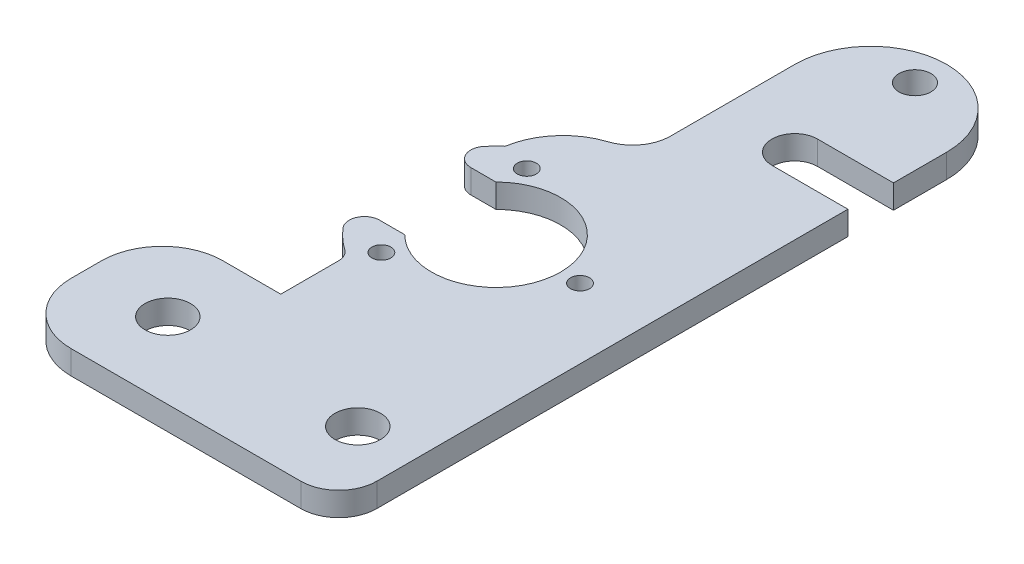
ISO-10303-21;
HEADER;
FILE_DESCRIPTION(('STEP AP214'),'2;1');
FILE_NAME('part.step','',(''),(''),'','','');
FILE_SCHEMA(('AUTOMOTIVE_DESIGN { 1 0 10303 214 1 1 1 1 }'));
ENDSEC;
DATA;
#1=APPLICATION_CONTEXT('core data for automotive mechanical design processes');
#2=APPLICATION_PROTOCOL_DEFINITION('international standard','automotive_design',2000,#1);
#3=PRODUCT_CONTEXT('',#1,'mechanical');
#4=PRODUCT('Part','Part','',(#3));
#5=PRODUCT_RELATED_PRODUCT_CATEGORY('part','',(#4));
#6=PRODUCT_DEFINITION_FORMATION('','',#4);
#7=PRODUCT_DEFINITION_CONTEXT('part definition',#1,'design');
#8=PRODUCT_DEFINITION('design','',#6,#7);
#9=PRODUCT_DEFINITION_SHAPE('','',#8);
#10=(LENGTH_UNIT() NAMED_UNIT(*) SI_UNIT(.MILLI.,.METRE.));
#11=(NAMED_UNIT(*) PLANE_ANGLE_UNIT() SI_UNIT($,.RADIAN.));
#12=(NAMED_UNIT(*) SI_UNIT($,.STERADIAN.) SOLID_ANGLE_UNIT());
#13=UNCERTAINTY_MEASURE_WITH_UNIT(LENGTH_MEASURE(1.E-05),#10,'distance_accuracy_value','');
#14=(GEOMETRIC_REPRESENTATION_CONTEXT(3) GLOBAL_UNCERTAINTY_ASSIGNED_CONTEXT((#13)) GLOBAL_UNIT_ASSIGNED_CONTEXT((#10,
#11,#12)) REPRESENTATION_CONTEXT('',''));
#15=CARTESIAN_POINT('',(0.,0.,0.));
#16=DIRECTION('',(0.,0.,1.));
#17=DIRECTION('',(1.,0.,0.));
#18=AXIS2_PLACEMENT_3D('',#15,#16,#17);
#19=CARTESIAN_POINT('',(43.2374928704917,111.775350881739,110.03328141703));
#20=DIRECTION('',(1.,0.,0.));
#21=DIRECTION('',(0.,1.,0.));
#22=AXIS2_PLACEMENT_3D('',#19,#20,#21);
#23=PLANE('',#22);
#24=DIRECTION('',(0.,1.,0.));
#25=VECTOR('',#24,1.);
#26=CARTESIAN_POINT('',(43.2374928704916,108.650350881738,123.037999922887));
#27=LINE('',#26,#25);
#28=CARTESIAN_POINT('',(43.2374928704916,108.650350881738,123.037999922887));
#29=VERTEX_POINT('',#28);
#30=CARTESIAN_POINT('',(43.2374928704916,111.775350881739,123.037999922887));
#31=VERTEX_POINT('',#30);
#32=EDGE_CURVE('E629',#29,#31,#27,.T.);
#33=ORIENTED_EDGE('',*,*,#32,.T.);
#34=DIRECTION('',(0.,0.,1.));
#35=VECTOR('',#34,1.);
#36=CARTESIAN_POINT('',(43.2374928704917,111.775350881739,110.03328141703));
#37=LINE('',#36,#35);
#38=CARTESIAN_POINT('',(43.2374928704916,111.775350881739,185.037999922887));
#39=VERTEX_POINT('',#38);
#40=EDGE_CURVE('E644',#31,#39,#37,.T.);
#41=ORIENTED_EDGE('',*,*,#40,.T.);
#42=DIRECTION('',(0.,-1.,0.));
#43=VECTOR('',#42,1.);
#44=CARTESIAN_POINT('',(43.2374928704916,111.775350881739,185.037999922887));
#45=LINE('',#44,#43);
#46=CARTESIAN_POINT('',(43.2374928704916,108.650350881739,185.037999922887));
#47=VERTEX_POINT('',#46);
#48=EDGE_CURVE('E305',#39,#47,#45,.T.);
#49=ORIENTED_EDGE('',*,*,#48,.T.);
#50=DIRECTION('',(0.,0.,1.));
#51=VECTOR('',#50,1.);
#52=CARTESIAN_POINT('',(43.2374928704916,108.650350881739,110.03328141703));
#53=LINE('',#52,#51);
#54=EDGE_CURVE('E219',#29,#47,#53,.T.);
#55=ORIENTED_EDGE('',*,*,#54,.F.);
#56=EDGE_LOOP('',(#33,#41,#49,#55));
#57=FACE_BOUND('',#56,.T.);
#58=ADVANCED_FACE('F32',(#57),#23,.T.);
#59=CARTESIAN_POINT('',(33.2374928704917,111.775350881739,110.03328141703));
#60=DIRECTION('',(0.,-1.,0.));
#61=DIRECTION('',(1.,0.,0.));
#62=AXIS2_PLACEMENT_3D('',#59,#60,#61);
#63=CYLINDRICAL_SURFACE('',#62,9.99999999999998);
#64=CARTESIAN_POINT('',(33.2374928704917,108.650350881739,110.03328141703));
#65=DIRECTION('',(0.,-1.,0.));
#66=DIRECTION('',(1.,0.,0.));
#67=AXIS2_PLACEMENT_3D('',#64,#65,#66);
#68=CIRCLE('',#67,9.99999999999998);
#69=CARTESIAN_POINT('',(23.2374928704917,108.650350881739,110.03328141703));
#70=VERTEX_POINT('',#69);
#71=CARTESIAN_POINT('',(43.2374928704916,108.650350881739,110.03328141703));
#72=VERTEX_POINT('',#71);
#73=EDGE_CURVE('E216',#70,#72,#68,.T.);
#74=ORIENTED_EDGE('',*,*,#73,.F.);
#75=DIRECTION('',(0.,-1.,0.));
#76=VECTOR('',#75,1.);
#77=CARTESIAN_POINT('',(23.2374928704917,111.775350881739,110.03328141703));
#78=LINE('',#77,#76);
#79=CARTESIAN_POINT('',(23.2374928704917,111.775350881739,110.03328141703));
#80=VERTEX_POINT('',#79);
#81=EDGE_CURVE('E11',#80,#70,#78,.T.);
#82=ORIENTED_EDGE('',*,*,#81,.F.);
#83=CARTESIAN_POINT('',(33.2374928704917,111.775350881739,110.03328141703));
#84=DIRECTION('',(0.,-1.,0.));
#85=DIRECTION('',(1.,0.,0.));
#86=AXIS2_PLACEMENT_3D('',#83,#84,#85);
#87=CIRCLE('',#86,9.99999999999998);
#88=CARTESIAN_POINT('',(43.2374928704917,111.775350881739,110.03328141703));
#89=VERTEX_POINT('',#88);
#90=EDGE_CURVE('E274',#80,#89,#87,.T.);
#91=ORIENTED_EDGE('',*,*,#90,.T.);
#92=DIRECTION('',(0.,-1.,0.));
#93=VECTOR('',#92,1.);
#94=CARTESIAN_POINT('',(43.2374928704917,111.775350881739,110.03328141703));
#95=LINE('',#94,#93);
#96=EDGE_CURVE('E36',#89,#72,#95,.T.);
#97=ORIENTED_EDGE('',*,*,#96,.T.);
#98=EDGE_LOOP('',(#74,#82,#91,#97));
#99=FACE_BOUND('',#98,.T.);
#100=ADVANCED_FACE('F34',(#99),#63,.T.);
#101=CARTESIAN_POINT('',(23.2374928704917,111.775350881739,126.368020112513));
#102=DIRECTION('',(-1.,0.,0.));
#103=DIRECTION('',(0.,-1.,0.));
#104=AXIS2_PLACEMENT_3D('',#101,#102,#103);
#105=PLANE('',#104);
#106=DIRECTION('',(0.,0.,-1.));
#107=VECTOR('',#106,1.);
#108=CARTESIAN_POINT('',(23.2374928704917,108.650350881739,126.368020112513));
#109=LINE('',#108,#107);
#110=CARTESIAN_POINT('',(23.2374928704916,108.650350881739,126.368020112513));
#111=VERTEX_POINT('',#110);
#112=EDGE_CURVE('E272',#111,#70,#109,.T.);
#113=ORIENTED_EDGE('',*,*,#112,.F.);
#114=DIRECTION('',(0.,-1.,0.));
#115=VECTOR('',#114,1.);
#116=CARTESIAN_POINT('',(23.2374928704916,111.775350881739,126.368020112513));
#117=LINE('',#116,#115);
#118=CARTESIAN_POINT('',(23.2374928704916,111.775350881739,126.368020112513));
#119=VERTEX_POINT('',#118);
#120=EDGE_CURVE('E41',#119,#111,#117,.T.);
#121=ORIENTED_EDGE('',*,*,#120,.F.);
#122=DIRECTION('',(0.,0.,-1.));
#123=VECTOR('',#122,1.);
#124=CARTESIAN_POINT('',(23.2374928704917,111.775350881739,126.368020112513));
#125=LINE('',#124,#123);
#126=EDGE_CURVE('E206',#119,#80,#125,.T.);
#127=ORIENTED_EDGE('',*,*,#126,.T.);
#128=ORIENTED_EDGE('',*,*,#81,.T.);
#129=EDGE_LOOP('',(#113,#121,#127,#128));
#130=FACE_BOUND('',#129,.T.);
#131=ADVANCED_FACE('F320',(#130),#105,.T.);
#132=CARTESIAN_POINT('',(18.2374928704917,111.775350881739,126.368020112513));
#133=DIRECTION('',(0.,-1.,0.));
#134=DIRECTION('',(1.,0.,0.));
#135=AXIS2_PLACEMENT_3D('',#132,#133,#134);
#136=CYLINDRICAL_SURFACE('',#135,4.99999999999989);
#137=CARTESIAN_POINT('',(18.2374928704917,108.650350881739,126.368020112513));
#138=DIRECTION('',(0.,1.,0.));
#139=DIRECTION('',(-1.,0.,0.));
#140=AXIS2_PLACEMENT_3D('',#137,#138,#139);
#141=CIRCLE('',#140,4.99999999999989);
#142=CARTESIAN_POINT('',(19.7743921471171,108.650350881739,131.125954602763));
#143=VERTEX_POINT('',#142);
#144=EDGE_CURVE('E192',#143,#111,#141,.T.);
#145=ORIENTED_EDGE('',*,*,#144,.F.);
#146=DIRECTION('',(0.,-1.,0.));
#147=VECTOR('',#146,1.);
#148=CARTESIAN_POINT('',(19.7743921471171,111.775350881739,131.125954602763));
#149=LINE('',#148,#147);
#150=CARTESIAN_POINT('',(19.7743921471171,111.775350881739,131.125954602763));
#151=VERTEX_POINT('',#150);
#152=EDGE_CURVE('E186',#151,#143,#149,.T.);
#153=ORIENTED_EDGE('',*,*,#152,.F.);
#154=CARTESIAN_POINT('',(18.2374928704917,111.775350881739,126.368020112513));
#155=DIRECTION('',(0.,1.,0.));
#156=DIRECTION('',(-1.,0.,0.));
#157=AXIS2_PLACEMENT_3D('',#154,#155,#156);
#158=CIRCLE('',#157,4.99999999999989);
#159=EDGE_CURVE('E189',#151,#119,#158,.T.);
#160=ORIENTED_EDGE('',*,*,#159,.T.);
#161=ORIENTED_EDGE('',*,*,#120,.T.);
#162=EDGE_LOOP('',(#145,#153,#160,#161));
#163=FACE_BOUND('',#162,.T.);
#164=ADVANCED_FACE('F188',(#163),#136,.F.);
#165=CARTESIAN_POINT('',(22.6068287457931,111.775350881739,139.894614975793));
#166=DIRECTION('',(0.,-1.,0.));
#167=DIRECTION('',(1.,0.,0.));
#168=AXIS2_PLACEMENT_3D('',#165,#166,#167);
#169=CYLINDRICAL_SURFACE('',#168,9.21477627634406);
#170=CARTESIAN_POINT('',(22.6068287457931,108.650350881739,139.894614975793));
#171=DIRECTION('',(0.,-1.,0.));
#172=DIRECTION('',(1.,0.,0.));
#173=AXIS2_PLACEMENT_3D('',#170,#171,#172);
#174=CIRCLE('',#173,9.21477627634406);
#175=CARTESIAN_POINT('',(13.5108446117126,108.650350881739,138.419767710606));
#176=VERTEX_POINT('',#175);
#177=EDGE_CURVE('E269',#176,#143,#174,.T.);
#178=ORIENTED_EDGE('',*,*,#177,.F.);
#179=DIRECTION('',(0.,-1.,0.));
#180=VECTOR('',#179,1.);
#181=CARTESIAN_POINT('',(13.5108446117126,111.775350881739,138.419767710606));
#182=LINE('',#181,#180);
#183=CARTESIAN_POINT('',(13.5108446117126,111.775350881739,138.419767710606));
#184=VERTEX_POINT('',#183);
#185=EDGE_CURVE('E197',#184,#176,#182,.T.);
#186=ORIENTED_EDGE('',*,*,#185,.F.);
#187=CARTESIAN_POINT('',(22.6068287457931,111.775350881739,139.894614975793));
#188=DIRECTION('',(0.,-1.,0.));
#189=DIRECTION('',(1.,0.,0.));
#190=AXIS2_PLACEMENT_3D('',#187,#188,#189);
#191=CIRCLE('',#190,9.21477627634406);
#192=EDGE_CURVE('E204',#184,#151,#191,.T.);
#193=ORIENTED_EDGE('',*,*,#192,.T.);
#194=ORIENTED_EDGE('',*,*,#152,.T.);
#195=EDGE_LOOP('',(#178,#186,#193,#194));
#196=FACE_BOUND('',#195,.T.);
#197=ADVANCED_FACE('F208',(#196),#169,.T.);
#198=CARTESIAN_POINT('',(22.9999928705025,111.775350881739,149.100999922889));
#199=DIRECTION('',(0.,-1.,0.));
#200=DIRECTION('',(1.,0.,0.));
#201=AXIS2_PLACEMENT_3D('',#198,#199,#200);
#202=CYLINDRICAL_SURFACE('',#201,14.2875);
#203=CARTESIAN_POINT('',(22.9999928705025,108.650350881739,149.100999922889));
#204=DIRECTION('',(0.,-1.,0.));
#205=DIRECTION('',(1.,0.,0.));
#206=AXIS2_PLACEMENT_3D('',#203,#204,#205);
#207=CIRCLE('',#206,14.2875);
#208=CARTESIAN_POINT('',(12.1555050456864,108.650350881739,139.798863605493));
#209=VERTEX_POINT('',#208);
#210=EDGE_CURVE('E266',#209,#176,#207,.T.);
#211=ORIENTED_EDGE('',*,*,#210,.F.);
#212=DIRECTION('',(0.,-1.,0.));
#213=VECTOR('',#212,1.);
#214=CARTESIAN_POINT('',(12.1555050456864,111.775350881739,139.798863605493));
#215=LINE('',#214,#213);
#216=CARTESIAN_POINT('',(12.1555050456864,111.775350881739,139.798863605493));
#217=VERTEX_POINT('',#216);
#218=EDGE_CURVE('E278',#217,#209,#215,.T.);
#219=ORIENTED_EDGE('',*,*,#218,.F.);
#220=CARTESIAN_POINT('',(22.9999928705025,111.775350881739,149.100999922889));
#221=DIRECTION('',(0.,-1.,0.));
#222=DIRECTION('',(1.,0.,0.));
#223=AXIS2_PLACEMENT_3D('',#220,#221,#222);
#224=CIRCLE('',#223,14.2875);
#225=EDGE_CURVE('E209',#217,#184,#224,.T.);
#226=ORIENTED_EDGE('',*,*,#225,.T.);
#227=ORIENTED_EDGE('',*,*,#185,.T.);
#228=EDGE_LOOP('',(#211,#219,#226,#227));
#229=FACE_BOUND('',#228,.T.);
#230=ADVANCED_FACE('F397',(#229),#202,.T.);
#231=CARTESIAN_POINT('',(13.673543586343,111.775350881739,141.100999922889));
#232=DIRECTION('',(0.,-1.,0.));
#233=DIRECTION('',(1.,0.,0.));
#234=AXIS2_PLACEMENT_3D('',#231,#232,#233);
#235=CYLINDRICAL_SURFACE('',#234,2.);
#236=CARTESIAN_POINT('',(13.673543586343,108.650350881739,141.100999922889));
#237=DIRECTION('',(0.,-1.,0.));
#238=DIRECTION('',(1.,0.,0.));
#239=AXIS2_PLACEMENT_3D('',#236,#237,#238);
#240=CIRCLE('',#239,2.);
#241=CARTESIAN_POINT('',(13.673543586343,108.650350881739,143.100999922889));
#242=VERTEX_POINT('',#241);
#243=EDGE_CURVE('E263',#242,#209,#240,.T.);
#244=ORIENTED_EDGE('',*,*,#243,.F.);
#245=DIRECTION('',(0.,-1.,0.));
#246=VECTOR('',#245,1.);
#247=CARTESIAN_POINT('',(13.673543586343,111.775350881739,143.100999922889));
#248=LINE('',#247,#246);
#249=CARTESIAN_POINT('',(13.673543586343,111.775350881739,143.100999922889));
#250=VERTEX_POINT('',#249);
#251=EDGE_CURVE('E280',#250,#242,#248,.T.);
#252=ORIENTED_EDGE('',*,*,#251,.F.);
#253=CARTESIAN_POINT('',(13.673543586343,111.775350881739,141.100999922889));
#254=DIRECTION('',(0.,-1.,0.));
#255=DIRECTION('',(1.,0.,0.));
#256=AXIS2_PLACEMENT_3D('',#253,#254,#255);
#257=CIRCLE('',#256,2.);
#258=EDGE_CURVE('E211',#250,#217,#257,.T.);
#259=ORIENTED_EDGE('',*,*,#258,.T.);
#260=ORIENTED_EDGE('',*,*,#218,.T.);
#261=EDGE_LOOP('',(#244,#252,#259,#260));
#262=FACE_BOUND('',#261,.T.);
#263=ADVANCED_FACE('F393',(#262),#235,.T.);
#264=CARTESIAN_POINT('',(16.9791955811063,111.775350881739,143.100999922889));
#265=DIRECTION('',(0.,0.,1.));
#266=DIRECTION('',(1.,0.,0.));
#267=AXIS2_PLACEMENT_3D('',#264,#265,#266);
#268=PLANE('',#267);
#269=DIRECTION('',(-1.,0.,0.));
#270=VECTOR('',#269,1.);
#271=CARTESIAN_POINT('',(16.9791955811063,108.650350881739,143.100999922889));
#272=LINE('',#271,#270);
#273=CARTESIAN_POINT('',(16.9791955811063,108.650350881739,143.100999922889));
#274=VERTEX_POINT('',#273);
#275=EDGE_CURVE('E260',#274,#242,#272,.T.);
#276=ORIENTED_EDGE('',*,*,#275,.F.);
#277=DIRECTION('',(0.,-1.,0.));
#278=VECTOR('',#277,1.);
#279=CARTESIAN_POINT('',(16.9791955811063,111.775350881739,143.100999922889));
#280=LINE('',#279,#278);
#281=CARTESIAN_POINT('',(16.9791955811063,111.775350881739,143.100999922889));
#282=VERTEX_POINT('',#281);
#283=EDGE_CURVE('E282',#282,#274,#280,.T.);
#284=ORIENTED_EDGE('',*,*,#283,.F.);
#285=DIRECTION('',(-1.,0.,0.));
#286=VECTOR('',#285,1.);
#287=CARTESIAN_POINT('',(16.9791955811063,111.775350881739,143.100999922889));
#288=LINE('',#287,#286);
#289=EDGE_CURVE('E683',#282,#250,#288,.T.);
#290=ORIENTED_EDGE('',*,*,#289,.T.);
#291=ORIENTED_EDGE('',*,*,#251,.T.);
#292=EDGE_LOOP('',(#276,#284,#290,#291));
#293=FACE_BOUND('',#292,.T.);
#294=ADVANCED_FACE('F389',(#293),#268,.T.);
#295=CARTESIAN_POINT('',(22.9999928705025,111.775350881739,149.100999922889));
#296=DIRECTION('',(0.,-1.,0.));
#297=DIRECTION('',(1.,0.,0.));
#298=AXIS2_PLACEMENT_3D('',#295,#296,#297);
#299=CYLINDRICAL_SURFACE('',#298,8.50000000000004);
#300=CARTESIAN_POINT('',(22.9999928705025,108.650350881739,149.100999922889));
#301=DIRECTION('',(0.,1.,0.));
#302=DIRECTION('',(-1.,0.,0.));
#303=AXIS2_PLACEMENT_3D('',#300,#301,#302);
#304=CIRCLE('',#303,8.50000000000004);
#305=CARTESIAN_POINT('',(16.9791955811063,108.650350881739,155.100999922889));
#306=VERTEX_POINT('',#305);
#307=EDGE_CURVE('E257',#306,#274,#304,.T.);
#308=ORIENTED_EDGE('',*,*,#307,.F.);
#309=DIRECTION('',(0.,-1.,0.));
#310=VECTOR('',#309,1.);
#311=CARTESIAN_POINT('',(16.9791955811063,111.775350881739,155.100999922889));
#312=LINE('',#311,#310);
#313=CARTESIAN_POINT('',(16.9791955811063,111.775350881739,155.100999922889));
#314=VERTEX_POINT('',#313);
#315=EDGE_CURVE('E284',#314,#306,#312,.T.);
#316=ORIENTED_EDGE('',*,*,#315,.F.);
#317=CARTESIAN_POINT('',(22.9999928705025,111.775350881739,149.100999922889));
#318=DIRECTION('',(0.,1.,0.));
#319=DIRECTION('',(-1.,0.,0.));
#320=AXIS2_PLACEMENT_3D('',#317,#318,#319);
#321=CIRCLE('',#320,8.50000000000004);
#322=EDGE_CURVE('E680',#314,#282,#321,.T.);
#323=ORIENTED_EDGE('',*,*,#322,.T.);
#324=ORIENTED_EDGE('',*,*,#283,.T.);
#325=EDGE_LOOP('',(#308,#316,#323,#324));
#326=FACE_BOUND('',#325,.T.);
#327=ADVANCED_FACE('F385',(#326),#299,.F.);
#328=CARTESIAN_POINT('',(13.6735435863429,111.775350881739,155.100999922889));
#329=DIRECTION('',(0.,0.,-1.));
#330=DIRECTION('',(0.,1.,0.));
#331=AXIS2_PLACEMENT_3D('',#328,#329,#330);
#332=PLANE('',#331);
#333=DIRECTION('',(1.,0.,0.));
#334=VECTOR('',#333,1.);
#335=CARTESIAN_POINT('',(13.6735435863429,108.650350881739,155.100999922889));
#336=LINE('',#335,#334);
#337=CARTESIAN_POINT('',(13.6735435863429,108.650350881739,155.100999922889));
#338=VERTEX_POINT('',#337);
#339=EDGE_CURVE('E254',#338,#306,#336,.T.);
#340=ORIENTED_EDGE('',*,*,#339,.F.);
#341=DIRECTION('',(0.,-1.,0.));
#342=VECTOR('',#341,1.);
#343=CARTESIAN_POINT('',(13.6735435863429,111.775350881739,155.100999922889));
#344=LINE('',#343,#342);
#345=CARTESIAN_POINT('',(13.6735435863429,111.775350881739,155.100999922889));
#346=VERTEX_POINT('',#345);
#347=EDGE_CURVE('E286',#346,#338,#344,.T.);
#348=ORIENTED_EDGE('',*,*,#347,.F.);
#349=DIRECTION('',(1.,0.,0.));
#350=VECTOR('',#349,1.);
#351=CARTESIAN_POINT('',(13.6735435863429,111.775350881739,155.100999922889));
#352=LINE('',#351,#350);
#353=EDGE_CURVE('E677',#346,#314,#352,.T.);
#354=ORIENTED_EDGE('',*,*,#353,.T.);
#355=ORIENTED_EDGE('',*,*,#315,.T.);
#356=EDGE_LOOP('',(#340,#348,#354,#355));
#357=FACE_BOUND('',#356,.T.);
#358=ADVANCED_FACE('F381',(#357),#332,.T.);
#359=CARTESIAN_POINT('',(13.6735435863429,111.775350881739,157.100999922889));
#360=DIRECTION('',(0.,-1.,0.));
#361=DIRECTION('',(1.,0.,0.));
#362=AXIS2_PLACEMENT_3D('',#359,#360,#361);
#363=CYLINDRICAL_SURFACE('',#362,1.99999999999997);
#364=CARTESIAN_POINT('',(13.6735435863429,108.650350881739,157.100999922889));
#365=DIRECTION('',(0.,-1.,0.));
#366=DIRECTION('',(1.,0.,0.));
#367=AXIS2_PLACEMENT_3D('',#364,#365,#366);
#368=CIRCLE('',#367,1.99999999999997);
#369=CARTESIAN_POINT('',(12.1555050456862,108.650350881739,158.403136240285));
#370=VERTEX_POINT('',#369);
#371=EDGE_CURVE('E251',#370,#338,#368,.T.);
#372=ORIENTED_EDGE('',*,*,#371,.F.);
#373=DIRECTION('',(0.,-1.,0.));
#374=VECTOR('',#373,1.);
#375=CARTESIAN_POINT('',(12.1555050456862,111.775350881739,158.403136240285));
#376=LINE('',#375,#374);
#377=CARTESIAN_POINT('',(12.1555050456862,111.775350881739,158.403136240285));
#378=VERTEX_POINT('',#377);
#379=EDGE_CURVE('E288',#378,#370,#376,.T.);
#380=ORIENTED_EDGE('',*,*,#379,.F.);
#381=CARTESIAN_POINT('',(13.6735435863429,111.775350881739,157.100999922889));
#382=DIRECTION('',(0.,-1.,0.));
#383=DIRECTION('',(1.,0.,0.));
#384=AXIS2_PLACEMENT_3D('',#381,#382,#383);
#385=CIRCLE('',#384,1.99999999999997);
#386=EDGE_CURVE('E674',#378,#346,#385,.T.);
#387=ORIENTED_EDGE('',*,*,#386,.T.);
#388=ORIENTED_EDGE('',*,*,#347,.T.);
#389=EDGE_LOOP('',(#372,#380,#387,#388));
#390=FACE_BOUND('',#389,.T.);
#391=ADVANCED_FACE('F377',(#390),#363,.T.);
#392=CARTESIAN_POINT('',(22.9999928705025,111.775350881739,149.100999922889));
#393=DIRECTION('',(0.,-1.,0.));
#394=DIRECTION('',(1.,0.,0.));
#395=AXIS2_PLACEMENT_3D('',#392,#393,#394);
#396=CYLINDRICAL_SURFACE('',#395,14.2875000000001);
#397=CARTESIAN_POINT('',(22.9999928705025,108.650350881739,149.100999922889));
#398=DIRECTION('',(0.,-1.,0.));
#399=DIRECTION('',(1.,0.,0.));
#400=AXIS2_PLACEMENT_3D('',#397,#398,#399);
#401=CIRCLE('',#400,14.2875000000001);
#402=CARTESIAN_POINT('',(14.7577675849363,108.650350881739,160.771406025162));
#403=VERTEX_POINT('',#402);
#404=EDGE_CURVE('E248',#403,#370,#401,.T.);
#405=ORIENTED_EDGE('',*,*,#404,.F.);
#406=DIRECTION('',(0.,-1.,0.));
#407=VECTOR('',#406,1.);
#408=CARTESIAN_POINT('',(14.7577675849363,111.775350881739,160.771406025162));
#409=LINE('',#408,#407);
#410=CARTESIAN_POINT('',(14.7577675849363,111.775350881739,160.771406025162));
#411=VERTEX_POINT('',#410);
#412=EDGE_CURVE('E290',#411,#403,#409,.T.);
#413=ORIENTED_EDGE('',*,*,#412,.F.);
#414=CARTESIAN_POINT('',(22.9999928705025,111.775350881739,149.100999922889));
#415=DIRECTION('',(0.,-1.,0.));
#416=DIRECTION('',(1.,0.,0.));
#417=AXIS2_PLACEMENT_3D('',#414,#415,#416);
#418=CIRCLE('',#417,14.2875000000001);
#419=EDGE_CURVE('E671',#411,#378,#418,.T.);
#420=ORIENTED_EDGE('',*,*,#419,.T.);
#421=ORIENTED_EDGE('',*,*,#379,.T.);
#422=EDGE_LOOP('',(#405,#413,#420,#421));
#423=FACE_BOUND('',#422,.T.);
#424=ADVANCED_FACE('F373',(#423),#396,.T.);
#425=CARTESIAN_POINT('',(13.6040002658721,111.775350881739,162.4050586729));
#426=DIRECTION('',(0.,-1.,0.));
#427=DIRECTION('',(1.,0.,0.));
#428=AXIS2_PLACEMENT_3D('',#425,#426,#427);
#429=CYLINDRICAL_SURFACE('',#428,2.0000000000001);
#430=CARTESIAN_POINT('',(13.6040002658721,108.650350881739,162.4050586729));
#431=DIRECTION('',(0.,1.,0.));
#432=DIRECTION('',(-1.,0.,0.));
#433=AXIS2_PLACEMENT_3D('',#430,#431,#432);
#434=CIRCLE('',#433,2.0000000000001);
#435=CARTESIAN_POINT('',(15.6040002658721,108.650350881739,162.4050586729));
#436=VERTEX_POINT('',#435);
#437=EDGE_CURVE('E245',#436,#403,#434,.T.);
#438=ORIENTED_EDGE('',*,*,#437,.F.);
#439=DIRECTION('',(0.,-1.,0.));
#440=VECTOR('',#439,1.);
#441=CARTESIAN_POINT('',(15.6040002658721,111.775350881739,162.4050586729));
#442=LINE('',#441,#440);
#443=CARTESIAN_POINT('',(15.6040002658721,111.775350881739,162.4050586729));
#444=VERTEX_POINT('',#443);
#445=EDGE_CURVE('E292',#444,#436,#442,.T.);
#446=ORIENTED_EDGE('',*,*,#445,.F.);
#447=CARTESIAN_POINT('',(13.6040002658721,111.775350881739,162.4050586729));
#448=DIRECTION('',(0.,1.,0.));
#449=DIRECTION('',(-1.,0.,0.));
#450=AXIS2_PLACEMENT_3D('',#447,#448,#449);
#451=CIRCLE('',#450,2.0000000000001);
#452=EDGE_CURVE('E668',#444,#411,#451,.T.);
#453=ORIENTED_EDGE('',*,*,#452,.T.);
#454=ORIENTED_EDGE('',*,*,#412,.T.);
#455=EDGE_LOOP('',(#438,#446,#453,#454));
#456=FACE_BOUND('',#455,.T.);
#457=ADVANCED_FACE('F369',(#456),#429,.F.);
#458=CARTESIAN_POINT('',(15.6040002658721,111.775350881739,170.037999922887));
#459=DIRECTION('',(-1.,0.,0.));
#460=DIRECTION('',(0.,-1.,0.));
#461=AXIS2_PLACEMENT_3D('',#458,#459,#460);
#462=PLANE('',#461);
#463=DIRECTION('',(0.,0.,-1.));
#464=VECTOR('',#463,1.);
#465=CARTESIAN_POINT('',(15.6040002658721,108.650350881739,170.037999922887));
#466=LINE('',#465,#464);
#467=CARTESIAN_POINT('',(15.6040002658721,108.650350881739,170.037999922887));
#468=VERTEX_POINT('',#467);
#469=EDGE_CURVE('E242',#468,#436,#466,.T.);
#470=ORIENTED_EDGE('',*,*,#469,.F.);
#471=DIRECTION('',(0.,-1.,0.));
#472=VECTOR('',#471,1.);
#473=CARTESIAN_POINT('',(15.6040002658721,111.775350881739,170.037999922887));
#474=LINE('',#473,#472);
#475=CARTESIAN_POINT('',(15.6040002658721,111.775350881739,170.037999922887));
#476=VERTEX_POINT('',#475);
#477=EDGE_CURVE('E294',#476,#468,#474,.T.);
#478=ORIENTED_EDGE('',*,*,#477,.F.);
#479=DIRECTION('',(0.,0.,-1.));
#480=VECTOR('',#479,1.);
#481=CARTESIAN_POINT('',(15.6040002658721,111.775350881739,170.037999922887));
#482=LINE('',#481,#480);
#483=EDGE_CURVE('E665',#476,#444,#482,.T.);
#484=ORIENTED_EDGE('',*,*,#483,.T.);
#485=ORIENTED_EDGE('',*,*,#445,.T.);
#486=EDGE_LOOP('',(#470,#478,#484,#485));
#487=FACE_BOUND('',#486,.T.);
#488=ADVANCED_FACE('F365',(#487),#462,.T.);
#489=CARTESIAN_POINT('',(7.9999928705023,111.775350881739,170.037999922887));
#490=DIRECTION('',(0.,0.,-1.));
#491=DIRECTION('',(0.,1.,0.));
#492=AXIS2_PLACEMENT_3D('',#489,#490,#491);
#493=PLANE('',#492);
#494=DIRECTION('',(1.,0.,0.));
#495=VECTOR('',#494,1.);
#496=CARTESIAN_POINT('',(7.99999287050228,108.650350881739,170.037999922887));
#497=LINE('',#496,#495);
#498=CARTESIAN_POINT('',(7.99999287050228,108.650350881739,170.037999922887));
#499=VERTEX_POINT('',#498);
#500=EDGE_CURVE('E239',#499,#468,#497,.T.);
#501=ORIENTED_EDGE('',*,*,#500,.F.);
#502=DIRECTION('',(0.,-1.,0.));
#503=VECTOR('',#502,1.);
#504=CARTESIAN_POINT('',(7.9999928705023,111.775350881739,170.037999922887));
#505=LINE('',#504,#503);
#506=CARTESIAN_POINT('',(7.9999928705023,111.775350881739,170.037999922887));
#507=VERTEX_POINT('',#506);
#508=EDGE_CURVE('E296',#507,#499,#505,.T.);
#509=ORIENTED_EDGE('',*,*,#508,.F.);
#510=DIRECTION('',(1.,0.,0.));
#511=VECTOR('',#510,1.);
#512=CARTESIAN_POINT('',(7.9999928705023,111.775350881739,170.037999922887));
#513=LINE('',#512,#511);
#514=EDGE_CURVE('E662',#507,#476,#513,.T.);
#515=ORIENTED_EDGE('',*,*,#514,.T.);
#516=ORIENTED_EDGE('',*,*,#477,.T.);
#517=EDGE_LOOP('',(#501,#509,#515,#516));
#518=FACE_BOUND('',#517,.T.);
#519=ADVANCED_FACE('F361',(#518),#493,.T.);
#520=CARTESIAN_POINT('',(7.9999928705023,111.775350881739,178.037999922887));
#521=DIRECTION('',(0.,-1.,0.));
#522=DIRECTION('',(1.,0.,0.));
#523=AXIS2_PLACEMENT_3D('',#520,#521,#522);
#524=CYLINDRICAL_SURFACE('',#523,7.99999999999999);
#525=CARTESIAN_POINT('',(7.99999287050228,108.650350881739,178.037999922887));
#526=DIRECTION('',(0.,-1.,0.));
#527=DIRECTION('',(1.,0.,0.));
#528=AXIS2_PLACEMENT_3D('',#525,#526,#527);
#529=CIRCLE('',#528,7.99999999999999);
#530=CARTESIAN_POINT('',(-7.12949772371796E-06,108.650350881739,178.037999922887));
#531=VERTEX_POINT('',#530);
#532=EDGE_CURVE('E236',#531,#499,#529,.T.);
#533=ORIENTED_EDGE('',*,*,#532,.F.);
#534=DIRECTION('',(0.,-1.,0.));
#535=VECTOR('',#534,1.);
#536=CARTESIAN_POINT('',(-7.12949770034256E-06,111.775350881739,178.037999922887));
#537=LINE('',#536,#535);
#538=CARTESIAN_POINT('',(-7.12949770034256E-06,111.775350881739,178.037999922887));
#539=VERTEX_POINT('',#538);
#540=EDGE_CURVE('E298',#539,#531,#537,.T.);
#541=ORIENTED_EDGE('',*,*,#540,.F.);
#542=CARTESIAN_POINT('',(7.9999928705023,111.775350881739,178.037999922887));
#543=DIRECTION('',(0.,-1.,0.));
#544=DIRECTION('',(1.,0.,0.));
#545=AXIS2_PLACEMENT_3D('',#542,#543,#544);
#546=CIRCLE('',#545,7.99999999999999);
#547=EDGE_CURVE('E659',#539,#507,#546,.T.);
#548=ORIENTED_EDGE('',*,*,#547,.T.);
#549=ORIENTED_EDGE('',*,*,#508,.T.);
#550=EDGE_LOOP('',(#533,#541,#548,#549));
#551=FACE_BOUND('',#550,.T.);
#552=ADVANCED_FACE('F357',(#551),#524,.T.);
#553=CARTESIAN_POINT('',(-7.12949769971806E-06,111.775350881739,182.037999922887));
#554=DIRECTION('',(-1.,0.,0.));
#555=DIRECTION('',(0.,-1.,0.));
#556=AXIS2_PLACEMENT_3D('',#553,#554,#555);
#557=PLANE('',#556);
#558=DIRECTION('',(0.,0.,-1.));
#559=VECTOR('',#558,1.);
#560=CARTESIAN_POINT('',(-7.12949772309346E-06,108.650350881739,182.037999922887));
#561=LINE('',#560,#559);
#562=CARTESIAN_POINT('',(-7.12949772656291E-06,108.650350881739,182.037999922887));
#563=VERTEX_POINT('',#562);
#564=EDGE_CURVE('E233',#563,#531,#561,.T.);
#565=ORIENTED_EDGE('',*,*,#564,.F.);
#566=DIRECTION('',(0.,-1.,0.));
#567=VECTOR('',#566,1.);
#568=CARTESIAN_POINT('',(-7.12949770318751E-06,111.775350881739,182.037999922887));
#569=LINE('',#568,#567);
#570=CARTESIAN_POINT('',(-7.12949770318751E-06,111.775350881739,182.037999922887));
#571=VERTEX_POINT('',#570);
#572=EDGE_CURVE('E300',#571,#563,#569,.T.);
#573=ORIENTED_EDGE('',*,*,#572,.F.);
#574=DIRECTION('',(0.,0.,-1.));
#575=VECTOR('',#574,1.);
#576=CARTESIAN_POINT('',(-7.12949769971806E-06,111.775350881739,182.037999922887));
#577=LINE('',#576,#575);
#578=EDGE_CURVE('E656',#571,#539,#577,.T.);
#579=ORIENTED_EDGE('',*,*,#578,.T.);
#580=ORIENTED_EDGE('',*,*,#540,.T.);
#581=EDGE_LOOP('',(#565,#573,#579,#580));
#582=FACE_BOUND('',#581,.T.);
#583=ADVANCED_FACE('F353',(#582),#557,.T.);
#584=CARTESIAN_POINT('',(7.9999928705023,111.775350881739,182.037999922887));
#585=DIRECTION('',(0.,-1.,0.));
#586=DIRECTION('',(1.,0.,0.));
#587=AXIS2_PLACEMENT_3D('',#584,#585,#586);
#588=CYLINDRICAL_SURFACE('',#587,8.);
#589=CARTESIAN_POINT('',(7.99999287050228,108.650350881739,182.037999922887));
#590=DIRECTION('',(0.,-1.,0.));
#591=DIRECTION('',(1.,0.,0.));
#592=AXIS2_PLACEMENT_3D('',#589,#590,#591);
#593=CIRCLE('',#592,8.);
#594=CARTESIAN_POINT('',(7.99999287050229,108.650350881739,190.037999922887));
#595=VERTEX_POINT('',#594);
#596=EDGE_CURVE('E230',#595,#563,#593,.T.);
#597=ORIENTED_EDGE('',*,*,#596,.F.);
#598=DIRECTION('',(0.,-1.,0.));
#599=VECTOR('',#598,1.);
#600=CARTESIAN_POINT('',(7.99999287050231,111.775350881739,190.037999922887));
#601=LINE('',#600,#599);
#602=CARTESIAN_POINT('',(7.99999287050231,111.775350881739,190.037999922887));
#603=VERTEX_POINT('',#602);
#604=EDGE_CURVE('E302',#603,#595,#601,.T.);
#605=ORIENTED_EDGE('',*,*,#604,.F.);
#606=CARTESIAN_POINT('',(7.9999928705023,111.775350881739,182.037999922887));
#607=DIRECTION('',(0.,-1.,0.));
#608=DIRECTION('',(1.,0.,0.));
#609=AXIS2_PLACEMENT_3D('',#606,#607,#608);
#610=CIRCLE('',#609,8.);
#611=EDGE_CURVE('E653',#603,#571,#610,.T.);
#612=ORIENTED_EDGE('',*,*,#611,.T.);
#613=ORIENTED_EDGE('',*,*,#572,.T.);
#614=EDGE_LOOP('',(#597,#605,#612,#613));
#615=FACE_BOUND('',#614,.T.);
#616=ADVANCED_FACE('F347',(#615),#588,.T.);
#617=CARTESIAN_POINT('',(38.2374928704917,111.775350881739,190.037999922887));
#618=DIRECTION('',(0.,0.,1.));
#619=DIRECTION('',(0.,-1.,0.));
#620=AXIS2_PLACEMENT_3D('',#617,#618,#619);
#621=PLANE('',#620);
#622=DIRECTION('',(-1.,0.,0.));
#623=VECTOR('',#622,1.);
#624=CARTESIAN_POINT('',(38.2374928704917,108.650350881739,190.037999922887));
#625=LINE('',#624,#623);
#626=CARTESIAN_POINT('',(38.2374928704917,108.650350881739,190.037999922887));
#627=VERTEX_POINT('',#626);
#628=EDGE_CURVE('E227',#627,#595,#625,.T.);
#629=ORIENTED_EDGE('',*,*,#628,.F.);
#630=DIRECTION('',(0.,-1.,0.));
#631=VECTOR('',#630,1.);
#632=CARTESIAN_POINT('',(38.2374928704917,111.775350881739,190.037999922887));
#633=LINE('',#632,#631);
#634=CARTESIAN_POINT('',(38.2374928704917,111.775350881739,190.037999922887));
#635=VERTEX_POINT('',#634);
#636=EDGE_CURVE('E304',#635,#627,#633,.T.);
#637=ORIENTED_EDGE('',*,*,#636,.F.);
#638=DIRECTION('',(-1.,0.,0.));
#639=VECTOR('',#638,1.);
#640=CARTESIAN_POINT('',(38.2374928704917,111.775350881739,190.037999922887));
#641=LINE('',#640,#639);
#642=EDGE_CURVE('E650',#635,#603,#641,.T.);
#643=ORIENTED_EDGE('',*,*,#642,.T.);
#644=ORIENTED_EDGE('',*,*,#604,.T.);
#645=EDGE_LOOP('',(#629,#637,#643,#644));
#646=FACE_BOUND('',#645,.T.);
#647=ADVANCED_FACE('F342',(#646),#621,.T.);
#648=CARTESIAN_POINT('',(38.2374928704917,111.775350881739,185.037999922887));
#649=DIRECTION('',(0.,-1.,0.));
#650=DIRECTION('',(1.,0.,0.));
#651=AXIS2_PLACEMENT_3D('',#648,#649,#650);
#652=CYLINDRICAL_SURFACE('',#651,4.99999999999996);
#653=CARTESIAN_POINT('',(38.2374928704917,108.650350881739,185.037999922887));
#654=DIRECTION('',(0.,-1.,0.));
#655=DIRECTION('',(1.,0.,0.));
#656=AXIS2_PLACEMENT_3D('',#653,#654,#655);
#657=CIRCLE('',#656,4.99999999999996);
#658=EDGE_CURVE('E224',#47,#627,#657,.T.);
#659=ORIENTED_EDGE('',*,*,#658,.F.);
#660=ORIENTED_EDGE('',*,*,#48,.F.);
#661=CARTESIAN_POINT('',(38.2374928704917,111.775350881739,185.037999922887));
#662=DIRECTION('',(0.,-1.,0.));
#663=DIRECTION('',(1.,0.,0.));
#664=AXIS2_PLACEMENT_3D('',#661,#662,#663);
#665=CIRCLE('',#664,4.99999999999996);
#666=EDGE_CURVE('E647',#39,#635,#665,.T.);
#667=ORIENTED_EDGE('',*,*,#666,.T.);
#668=ORIENTED_EDGE('',*,*,#636,.T.);
#669=EDGE_LOOP('',(#659,#660,#667,#668));
#670=FACE_BOUND('',#669,.T.);
#671=ADVANCED_FACE('F335',(#670),#652,.T.);
#672=DIRECTION('',(0.,1.,0.));
#673=VECTOR('',#672,1.);
#674=CARTESIAN_POINT('',(43.2374928704916,108.650350881738,117.037999922887));
#675=LINE('',#674,#673);
#676=CARTESIAN_POINT('',(43.2374928704916,108.650350881738,117.037999922887));
#677=VERTEX_POINT('',#676);
#678=CARTESIAN_POINT('',(43.2374928704916,111.775350881739,117.037999922887));
#679=VERTEX_POINT('',#678);
#680=EDGE_CURVE('E315',#677,#679,#675,.T.);
#681=ORIENTED_EDGE('',*,*,#680,.F.);
#682=EDGE_CURVE('E221',#72,#677,#53,.T.);
#683=ORIENTED_EDGE('',*,*,#682,.F.);
#684=ORIENTED_EDGE('',*,*,#96,.F.);
#685=EDGE_CURVE('E645',#89,#679,#37,.T.);
#686=ORIENTED_EDGE('',*,*,#685,.T.);
#687=EDGE_LOOP('',(#681,#683,#684,#686));
#688=FACE_BOUND('',#687,.T.);
#689=ADVANCED_FACE('F312',(#688),#23,.T.);
#690=CARTESIAN_POINT('',(33.2374928704917,111.775350881739,110.03328141703));
#691=DIRECTION('',(0.,-1.,0.));
#692=DIRECTION('',(1.,0.,0.));
#693=AXIS2_PLACEMENT_3D('',#690,#691,#692);
#694=PLANE('',#693);
#695=CARTESIAN_POINT('',(33.2374928704917,111.77535088174,104.211683364051));
#696=DIRECTION('',(0.,-1.,0.));
#697=DIRECTION('',(0.,0.,-1.));
#698=AXIS2_PLACEMENT_3D('',#695,#696,#697);
#699=CIRCLE('',#698,2.09999999999998);
#700=CARTESIAN_POINT('',(33.2374928704917,111.77535088174,102.111683364051));
#701=VERTEX_POINT('',#700);
#702=EDGE_CURVE('E585',#701,#701,#699,.T.);
#703=ORIENTED_EDGE('',*,*,#702,.T.);
#704=EDGE_LOOP('',(#703));
#705=FACE_BOUND('',#704,.T.);
#706=CARTESIAN_POINT('',(34.0489928705025,111.77535088174,149.100999922889));
#707=DIRECTION('',(0.,-1.,0.));
#708=DIRECTION('',(0.,0.,-1.));
#709=AXIS2_PLACEMENT_3D('',#706,#707,#708);
#710=CIRCLE('',#709,1.24999999999999);
#711=CARTESIAN_POINT('',(34.0489928705025,111.77535088174,147.850999922889));
#712=VERTEX_POINT('',#711);
#713=EDGE_CURVE('E595',#712,#712,#710,.T.);
#714=ORIENTED_EDGE('',*,*,#713,.T.);
#715=EDGE_LOOP('',(#714));
#716=FACE_BOUND('',#715,.T.);
#717=CARTESIAN_POINT('',(17.4754928705025,111.77535088174,158.669714609303));
#718=DIRECTION('',(0.,-1.,0.));
#719=DIRECTION('',(0.,0.,-1.));
#720=AXIS2_PLACEMENT_3D('',#717,#718,#719);
#721=CIRCLE('',#720,1.24999999999999);
#722=CARTESIAN_POINT('',(17.4754928705025,111.77535088174,157.419714609303));
#723=VERTEX_POINT('',#722);
#724=EDGE_CURVE('E601',#723,#723,#721,.T.);
#725=ORIENTED_EDGE('',*,*,#724,.T.);
#726=EDGE_LOOP('',(#725));
#727=FACE_BOUND('',#726,.T.);
#728=CARTESIAN_POINT('',(17.4754928705025,111.77535088174,139.532285236475));
#729=DIRECTION('',(0.,-1.,0.));
#730=DIRECTION('',(0.,0.,-1.));
#731=AXIS2_PLACEMENT_3D('',#728,#729,#730);
#732=CIRCLE('',#731,1.24999999999999);
#733=CARTESIAN_POINT('',(17.4754928705025,111.77535088174,138.282285236475));
#734=VERTEX_POINT('',#733);
#735=EDGE_CURVE('E607',#734,#734,#732,.T.);
#736=ORIENTED_EDGE('',*,*,#735,.T.);
#737=EDGE_LOOP('',(#736));
#738=FACE_BOUND('',#737,.T.);
#739=CARTESIAN_POINT('',(10.7374928704917,111.77535088174,180.037999922887));
#740=DIRECTION('',(0.,-1.,0.));
#741=DIRECTION('',(0.,0.,-1.));
#742=AXIS2_PLACEMENT_3D('',#739,#740,#741);
#743=CIRCLE('',#742,2.99999999999999);
#744=CARTESIAN_POINT('',(10.7374928704917,111.77535088174,177.037999922887));
#745=VERTEX_POINT('',#744);
#746=EDGE_CURVE('E613',#745,#745,#743,.T.);
#747=ORIENTED_EDGE('',*,*,#746,.T.);
#748=EDGE_LOOP('',(#747));
#749=FACE_BOUND('',#748,.T.);
#750=CARTESIAN_POINT('',(35.7374928704917,111.775350881739,180.037999922887));
#751=DIRECTION('',(0.,-1.,0.));
#752=DIRECTION('',(0.,0.,-1.));
#753=AXIS2_PLACEMENT_3D('',#750,#751,#752);
#754=CIRCLE('',#753,2.99999999999999);
#755=CARTESIAN_POINT('',(35.7374928704917,111.775350881739,177.037999922887));
#756=VERTEX_POINT('',#755);
#757=EDGE_CURVE('E619',#756,#756,#754,.T.);
#758=ORIENTED_EDGE('',*,*,#757,.T.);
#759=EDGE_LOOP('',(#758));
#760=FACE_BOUND('',#759,.T.);
#761=ORIENTED_EDGE('',*,*,#40,.F.);
#762=DIRECTION('',(1.,0.,0.));
#763=VECTOR('',#762,1.);
#764=CARTESIAN_POINT('',(33.2374928704916,111.775350881739,123.037999922887));
#765=LINE('',#764,#763);
#766=CARTESIAN_POINT('',(33.2374928704916,111.775350881739,123.037999922887));
#767=VERTEX_POINT('',#766);
#768=EDGE_CURVE('E622',#767,#31,#765,.T.);
#769=ORIENTED_EDGE('',*,*,#768,.F.);
#770=CARTESIAN_POINT('',(33.2374928704916,111.775350881739,120.037999922887));
#771=DIRECTION('',(0.,1.,0.));
#772=DIRECTION('',(-1.,0.,0.));
#773=AXIS2_PLACEMENT_3D('',#770,#771,#772);
#774=CIRCLE('',#773,3.00000000000001);
#775=CARTESIAN_POINT('',(33.2374928704916,111.775350881739,117.037999922887));
#776=VERTEX_POINT('',#775);
#777=EDGE_CURVE('E626',#776,#767,#774,.T.);
#778=ORIENTED_EDGE('',*,*,#777,.F.);
#779=DIRECTION('',(-1.,0.,0.));
#780=VECTOR('',#779,1.);
#781=CARTESIAN_POINT('',(43.2374928704916,111.775350881739,117.037999922887));
#782=LINE('',#781,#780);
#783=EDGE_CURVE('E632',#679,#776,#782,.T.);
#784=ORIENTED_EDGE('',*,*,#783,.F.);
#785=ORIENTED_EDGE('',*,*,#685,.F.);
#786=ORIENTED_EDGE('',*,*,#90,.F.);
#787=ORIENTED_EDGE('',*,*,#126,.F.);
#788=ORIENTED_EDGE('',*,*,#159,.F.);
#789=ORIENTED_EDGE('',*,*,#192,.F.);
#790=ORIENTED_EDGE('',*,*,#225,.F.);
#791=ORIENTED_EDGE('',*,*,#258,.F.);
#792=ORIENTED_EDGE('',*,*,#289,.F.);
#793=ORIENTED_EDGE('',*,*,#322,.F.);
#794=ORIENTED_EDGE('',*,*,#353,.F.);
#795=ORIENTED_EDGE('',*,*,#386,.F.);
#796=ORIENTED_EDGE('',*,*,#419,.F.);
#797=ORIENTED_EDGE('',*,*,#452,.F.);
#798=ORIENTED_EDGE('',*,*,#483,.F.);
#799=ORIENTED_EDGE('',*,*,#514,.F.);
#800=ORIENTED_EDGE('',*,*,#547,.F.);
#801=ORIENTED_EDGE('',*,*,#578,.F.);
#802=ORIENTED_EDGE('',*,*,#611,.F.);
#803=ORIENTED_EDGE('',*,*,#642,.F.);
#804=ORIENTED_EDGE('',*,*,#666,.F.);
#805=EDGE_LOOP('',(#761,#769,#778,#784,#785,#786,#787,#788,#789,#790,#791,#792,#793,#794,#795,
#796,#797,#798,#799,#800,#801,#802,#803,#804));
#806=FACE_BOUND('',#805,.T.);
#807=ADVANCED_FACE('F202',(#705,#716,#727,#738,#749,#760,#806),#694,.F.);
#808=CARTESIAN_POINT('',(33.2374928704917,108.650350881739,110.03328141703));
#809=DIRECTION('',(0.,-1.,0.));
#810=DIRECTION('',(1.,0.,0.));
#811=AXIS2_PLACEMENT_3D('',#808,#809,#810);
#812=PLANE('',#811);
#813=CARTESIAN_POINT('',(33.2374928704917,108.650350881739,104.211683364051));
#814=DIRECTION('',(0.,-1.,0.));
#815=DIRECTION('',(0.,0.,-1.));
#816=AXIS2_PLACEMENT_3D('',#813,#814,#815);
#817=CIRCLE('',#816,2.09999999999998);
#818=CARTESIAN_POINT('',(33.2374928704917,108.650350881739,102.111683364051));
#819=VERTEX_POINT('',#818);
#820=EDGE_CURVE('E588',#819,#819,#817,.T.);
#821=ORIENTED_EDGE('',*,*,#820,.F.);
#822=EDGE_LOOP('',(#821));
#823=FACE_BOUND('',#822,.T.);
#824=CARTESIAN_POINT('',(34.0489928705025,108.650350881739,149.100999922889));
#825=DIRECTION('',(0.,-1.,0.));
#826=DIRECTION('',(0.,0.,-1.));
#827=AXIS2_PLACEMENT_3D('',#824,#825,#826);
#828=CIRCLE('',#827,1.24999999999999);
#829=CARTESIAN_POINT('',(34.0489928705025,108.650350881739,147.850999922889));
#830=VERTEX_POINT('',#829);
#831=EDGE_CURVE('E590',#830,#830,#828,.T.);
#832=ORIENTED_EDGE('',*,*,#831,.F.);
#833=EDGE_LOOP('',(#832));
#834=FACE_BOUND('',#833,.T.);
#835=CARTESIAN_POINT('',(17.4754928705025,108.650350881739,158.669714609303));
#836=DIRECTION('',(0.,-1.,0.));
#837=DIRECTION('',(0.,0.,-1.));
#838=AXIS2_PLACEMENT_3D('',#835,#836,#837);
#839=CIRCLE('',#838,1.24999999999999);
#840=CARTESIAN_POINT('',(17.4754928705025,108.650350881739,157.419714609303));
#841=VERTEX_POINT('',#840);
#842=EDGE_CURVE('E598',#841,#841,#839,.T.);
#843=ORIENTED_EDGE('',*,*,#842,.F.);
#844=EDGE_LOOP('',(#843));
#845=FACE_BOUND('',#844,.T.);
#846=CARTESIAN_POINT('',(17.4754928705025,108.650350881739,139.532285236475));
#847=DIRECTION('',(0.,-1.,0.));
#848=DIRECTION('',(0.,0.,-1.));
#849=AXIS2_PLACEMENT_3D('',#846,#847,#848);
#850=CIRCLE('',#849,1.24999999999999);
#851=CARTESIAN_POINT('',(17.4754928705025,108.650350881739,138.282285236475));
#852=VERTEX_POINT('',#851);
#853=EDGE_CURVE('E604',#852,#852,#850,.T.);
#854=ORIENTED_EDGE('',*,*,#853,.F.);
#855=EDGE_LOOP('',(#854));
#856=FACE_BOUND('',#855,.T.);
#857=CARTESIAN_POINT('',(10.7374928704917,108.650350881739,180.037999922887));
#858=DIRECTION('',(0.,-1.,0.));
#859=DIRECTION('',(0.,0.,-1.));
#860=AXIS2_PLACEMENT_3D('',#857,#858,#859);
#861=CIRCLE('',#860,2.99999999999999);
#862=CARTESIAN_POINT('',(10.7374928704917,108.650350881739,177.037999922887));
#863=VERTEX_POINT('',#862);
#864=EDGE_CURVE('E610',#863,#863,#861,.T.);
#865=ORIENTED_EDGE('',*,*,#864,.F.);
#866=EDGE_LOOP('',(#865));
#867=FACE_BOUND('',#866,.T.);
#868=CARTESIAN_POINT('',(35.7374928704917,108.650350881739,180.037999922887));
#869=DIRECTION('',(0.,-1.,0.));
#870=DIRECTION('',(0.,0.,-1.));
#871=AXIS2_PLACEMENT_3D('',#868,#869,#870);
#872=CIRCLE('',#871,2.99999999999999);
#873=CARTESIAN_POINT('',(35.7374928704917,108.650350881739,177.037999922887));
#874=VERTEX_POINT('',#873);
#875=EDGE_CURVE('E616',#874,#874,#872,.T.);
#876=ORIENTED_EDGE('',*,*,#875,.F.);
#877=EDGE_LOOP('',(#876));
#878=FACE_BOUND('',#877,.T.);
#879=DIRECTION('',(1.,0.,0.));
#880=VECTOR('',#879,1.);
#881=CARTESIAN_POINT('',(33.2374928704916,108.650350881738,123.037999922887));
#882=LINE('',#881,#880);
#883=CARTESIAN_POINT('',(33.2374928704916,108.650350881738,123.037999922887));
#884=VERTEX_POINT('',#883);
#885=EDGE_CURVE('E623',#884,#29,#882,.T.);
#886=ORIENTED_EDGE('',*,*,#885,.T.);
#887=ORIENTED_EDGE('',*,*,#54,.T.);
#888=ORIENTED_EDGE('',*,*,#658,.T.);
#889=ORIENTED_EDGE('',*,*,#628,.T.);
#890=ORIENTED_EDGE('',*,*,#596,.T.);
#891=ORIENTED_EDGE('',*,*,#564,.T.);
#892=ORIENTED_EDGE('',*,*,#532,.T.);
#893=ORIENTED_EDGE('',*,*,#500,.T.);
#894=ORIENTED_EDGE('',*,*,#469,.T.);
#895=ORIENTED_EDGE('',*,*,#437,.T.);
#896=ORIENTED_EDGE('',*,*,#404,.T.);
#897=ORIENTED_EDGE('',*,*,#371,.T.);
#898=ORIENTED_EDGE('',*,*,#339,.T.);
#899=ORIENTED_EDGE('',*,*,#307,.T.);
#900=ORIENTED_EDGE('',*,*,#275,.T.);
#901=ORIENTED_EDGE('',*,*,#243,.T.);
#902=ORIENTED_EDGE('',*,*,#210,.T.);
#903=ORIENTED_EDGE('',*,*,#177,.T.);
#904=ORIENTED_EDGE('',*,*,#144,.T.);
#905=ORIENTED_EDGE('',*,*,#112,.T.);
#906=ORIENTED_EDGE('',*,*,#73,.T.);
#907=ORIENTED_EDGE('',*,*,#682,.T.);
#908=DIRECTION('',(-1.,0.,0.));
#909=VECTOR('',#908,1.);
#910=CARTESIAN_POINT('',(43.2374928704916,108.650350881738,117.037999922887));
#911=LINE('',#910,#909);
#912=CARTESIAN_POINT('',(33.2374928704916,108.650350881739,117.037999922887));
#913=VERTEX_POINT('',#912);
#914=EDGE_CURVE('E625',#677,#913,#911,.T.);
#915=ORIENTED_EDGE('',*,*,#914,.T.);
#916=CARTESIAN_POINT('',(33.2374928704916,108.650350881738,120.037999922887));
#917=DIRECTION('',(0.,1.,0.));
#918=DIRECTION('',(-1.,0.,0.));
#919=AXIS2_PLACEMENT_3D('',#916,#917,#918);
#920=CIRCLE('',#919,3.00000000000001);
#921=EDGE_CURVE('E49',#913,#884,#920,.T.);
#922=ORIENTED_EDGE('',*,*,#921,.T.);
#923=EDGE_LOOP('',(#886,#887,#888,#889,#890,#891,#892,#893,#894,#895,#896,#897,#898,#899,#900,
#901,#902,#903,#904,#905,#906,#907,#915,#922));
#924=FACE_BOUND('',#923,.T.);
#925=ADVANCED_FACE('F319',(#823,#834,#845,#856,#867,#878,#924),#812,.T.);
#926=CARTESIAN_POINT('',(33.2374928704916,108.650350881738,123.037999922887));
#927=DIRECTION('',(0.,0.,1.));
#928=DIRECTION('',(0.,-1.,0.));
#929=AXIS2_PLACEMENT_3D('',#926,#927,#928);
#930=PLANE('',#929);
#931=ORIENTED_EDGE('',*,*,#768,.T.);
#932=ORIENTED_EDGE('',*,*,#32,.F.);
#933=ORIENTED_EDGE('',*,*,#885,.F.);
#934=DIRECTION('',(0.,1.,0.));
#935=VECTOR('',#934,1.);
#936=CARTESIAN_POINT('',(33.2374928704916,108.650350881738,123.037999922887));
#937=LINE('',#936,#935);
#938=EDGE_CURVE('E220',#884,#767,#937,.T.);
#939=ORIENTED_EDGE('',*,*,#938,.T.);
#940=EDGE_LOOP('',(#931,#932,#933,#939));
#941=FACE_BOUND('',#940,.T.);
#942=ADVANCED_FACE('F483',(#941),#930,.F.);
#943=CARTESIAN_POINT('',(33.2374928704916,108.650350881738,120.037999922887));
#944=DIRECTION('',(0.,1.,0.));
#945=DIRECTION('',(-1.,0.,0.));
#946=AXIS2_PLACEMENT_3D('',#943,#944,#945);
#947=CYLINDRICAL_SURFACE('',#946,3.00000000000001);
#948=ORIENTED_EDGE('',*,*,#777,.T.);
#949=ORIENTED_EDGE('',*,*,#938,.F.);
#950=ORIENTED_EDGE('',*,*,#921,.F.);
#951=DIRECTION('',(0.,1.,0.));
#952=VECTOR('',#951,1.);
#953=CARTESIAN_POINT('',(33.2374928704916,108.650350881738,117.037999922887));
#954=LINE('',#953,#952);
#955=EDGE_CURVE('E639',#913,#776,#954,.T.);
#956=ORIENTED_EDGE('',*,*,#955,.T.);
#957=EDGE_LOOP('',(#948,#949,#950,#956));
#958=FACE_BOUND('',#957,.T.);
#959=ADVANCED_FACE('F487',(#958),#947,.F.);
#960=CARTESIAN_POINT('',(43.2374928704916,108.650350881738,117.037999922887));
#961=DIRECTION('',(0.,0.,-1.));
#962=DIRECTION('',(0.,1.,0.));
#963=AXIS2_PLACEMENT_3D('',#960,#961,#962);
#964=PLANE('',#963);
#965=ORIENTED_EDGE('',*,*,#783,.T.);
#966=ORIENTED_EDGE('',*,*,#955,.F.);
#967=ORIENTED_EDGE('',*,*,#914,.F.);
#968=ORIENTED_EDGE('',*,*,#680,.T.);
#969=EDGE_LOOP('',(#965,#966,#967,#968));
#970=FACE_BOUND('',#969,.T.);
#971=ADVANCED_FACE('F498',(#970),#964,.F.);
#972=CARTESIAN_POINT('',(35.7374928704917,108.650350881739,180.037999922887));
#973=DIRECTION('',(0.,-1.,0.));
#974=DIRECTION('',(0.,0.,-1.));
#975=AXIS2_PLACEMENT_3D('',#972,#973,#974);
#976=CYLINDRICAL_SURFACE('',#975,2.99999999999999);
#977=ORIENTED_EDGE('',*,*,#757,.F.);
#978=EDGE_LOOP('',(#977));
#979=FACE_BOUND('',#978,.T.);
#980=ORIENTED_EDGE('',*,*,#875,.T.);
#981=EDGE_LOOP('',(#980));
#982=FACE_BOUND('',#981,.T.);
#983=ADVANCED_FACE('F507',(#979,#982),#976,.F.);
#984=CARTESIAN_POINT('',(10.7374928704917,108.650350881739,180.037999922887));
#985=DIRECTION('',(0.,-1.,0.));
#986=DIRECTION('',(0.,0.,-1.));
#987=AXIS2_PLACEMENT_3D('',#984,#985,#986);
#988=CYLINDRICAL_SURFACE('',#987,2.99999999999999);
#989=ORIENTED_EDGE('',*,*,#746,.F.);
#990=EDGE_LOOP('',(#989));
#991=FACE_BOUND('',#990,.T.);
#992=ORIENTED_EDGE('',*,*,#864,.T.);
#993=EDGE_LOOP('',(#992));
#994=FACE_BOUND('',#993,.T.);
#995=ADVANCED_FACE('F517',(#991,#994),#988,.F.);
#996=CARTESIAN_POINT('',(17.4754928705025,108.650350881739,139.532285236475));
#997=DIRECTION('',(0.,-1.,0.));
#998=DIRECTION('',(0.,0.,-1.));
#999=AXIS2_PLACEMENT_3D('',#996,#997,#998);
#1000=CYLINDRICAL_SURFACE('',#999,1.24999999999999);
#1001=ORIENTED_EDGE('',*,*,#735,.F.);
#1002=EDGE_LOOP('',(#1001));
#1003=FACE_BOUND('',#1002,.T.);
#1004=ORIENTED_EDGE('',*,*,#853,.T.);
#1005=EDGE_LOOP('',(#1004));
#1006=FACE_BOUND('',#1005,.T.);
#1007=ADVANCED_FACE('F527',(#1003,#1006),#1000,.F.);
#1008=CARTESIAN_POINT('',(17.4754928705025,108.650350881739,158.669714609303));
#1009=DIRECTION('',(0.,-1.,0.));
#1010=DIRECTION('',(0.,0.,-1.));
#1011=AXIS2_PLACEMENT_3D('',#1008,#1009,#1010);
#1012=CYLINDRICAL_SURFACE('',#1011,1.24999999999999);
#1013=ORIENTED_EDGE('',*,*,#724,.F.);
#1014=EDGE_LOOP('',(#1013));
#1015=FACE_BOUND('',#1014,.T.);
#1016=ORIENTED_EDGE('',*,*,#842,.T.);
#1017=EDGE_LOOP('',(#1016));
#1018=FACE_BOUND('',#1017,.T.);
#1019=ADVANCED_FACE('F537',(#1015,#1018),#1012,.F.);
#1020=CARTESIAN_POINT('',(34.0489928705025,108.650350881739,149.100999922889));
#1021=DIRECTION('',(0.,-1.,0.));
#1022=DIRECTION('',(0.,0.,-1.));
#1023=AXIS2_PLACEMENT_3D('',#1020,#1021,#1022);
#1024=CYLINDRICAL_SURFACE('',#1023,1.24999999999999);
#1025=ORIENTED_EDGE('',*,*,#713,.F.);
#1026=EDGE_LOOP('',(#1025));
#1027=FACE_BOUND('',#1026,.T.);
#1028=ORIENTED_EDGE('',*,*,#831,.T.);
#1029=EDGE_LOOP('',(#1028));
#1030=FACE_BOUND('',#1029,.T.);
#1031=ADVANCED_FACE('F547',(#1027,#1030),#1024,.F.);
#1032=CARTESIAN_POINT('',(33.2374928704917,108.650350881739,104.211683364051));
#1033=DIRECTION('',(0.,-1.,0.));
#1034=DIRECTION('',(0.,0.,-1.));
#1035=AXIS2_PLACEMENT_3D('',#1032,#1033,#1034);
#1036=CYLINDRICAL_SURFACE('',#1035,2.09999999999998);
#1037=ORIENTED_EDGE('',*,*,#702,.F.);
#1038=EDGE_LOOP('',(#1037));
#1039=FACE_BOUND('',#1038,.T.);
#1040=ORIENTED_EDGE('',*,*,#820,.T.);
#1041=EDGE_LOOP('',(#1040));
#1042=FACE_BOUND('',#1041,.T.);
#1043=ADVANCED_FACE('F557',(#1039,#1042),#1036,.F.);
#1044=CLOSED_SHELL('',(#58,#100,#131,#164,#197,#230,#263,#294,#327,#358,#391,#424,#457,#488,
#519,#552,#583,#616,#647,#671,#689,#807,#925,#942,#959,#971,#983,#995,#1007,#1019,#1031,#1043));
#1045=MANIFOLD_SOLID_BREP('B2',#1044);
#1046=ADVANCED_BREP_SHAPE_REPRESENTATION('',(#18,#1045),#14);
#1047=SHAPE_DEFINITION_REPRESENTATION(#9,#1046);
ENDSEC;
END-ISO-10303-21;
